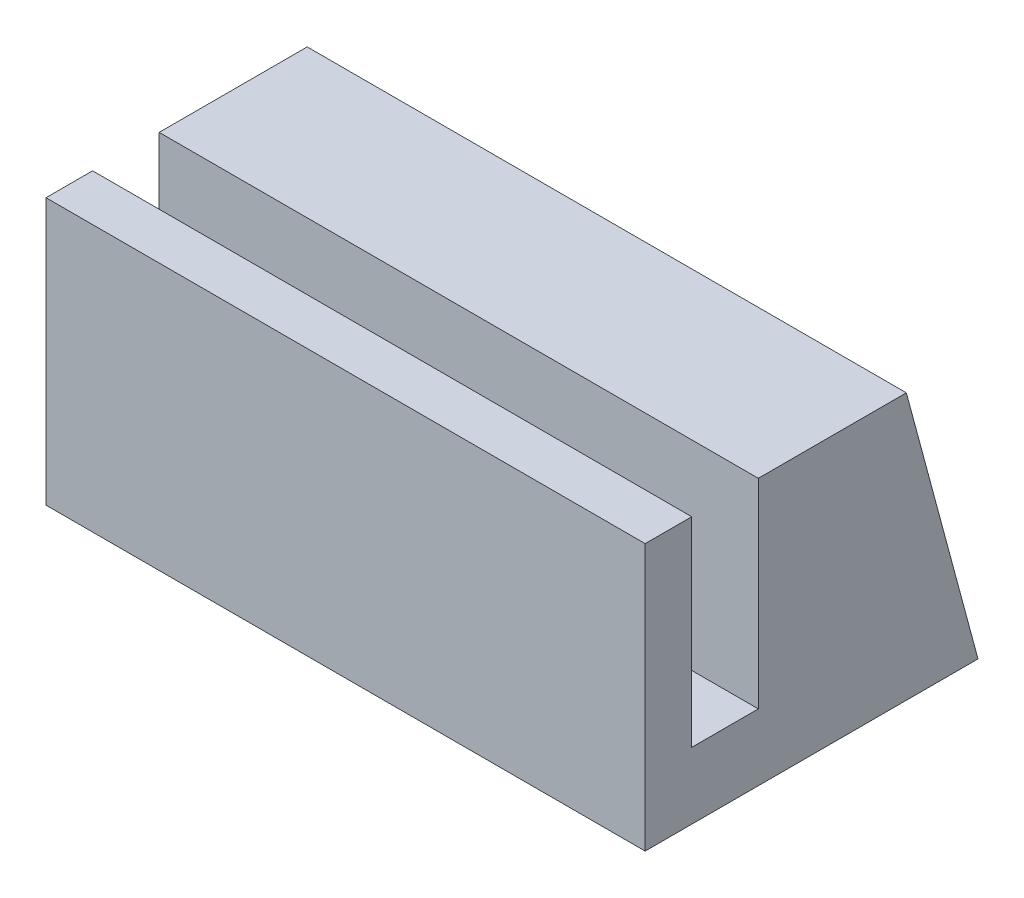
ISO-10303-21;
HEADER;
FILE_DESCRIPTION(('STEP AP214'),'2;1');
FILE_NAME('part.step','',(''),(''),'','','');
FILE_SCHEMA(('AUTOMOTIVE_DESIGN { 1 0 10303 214 1 1 1 1 }'));
ENDSEC;
DATA;
#1=APPLICATION_CONTEXT('core data for automotive mechanical design processes');
#2=APPLICATION_PROTOCOL_DEFINITION('international standard','automotive_design',2000,#1);
#3=PRODUCT_CONTEXT('',#1,'mechanical');
#4=PRODUCT('Part','Part','',(#3));
#5=PRODUCT_RELATED_PRODUCT_CATEGORY('part','',(#4));
#6=PRODUCT_DEFINITION_FORMATION('','',#4);
#7=PRODUCT_DEFINITION_CONTEXT('part definition',#1,'design');
#8=PRODUCT_DEFINITION('design','',#6,#7);
#9=PRODUCT_DEFINITION_SHAPE('','',#8);
#10=(LENGTH_UNIT() NAMED_UNIT(*) SI_UNIT(.MILLI.,.METRE.));
#11=(NAMED_UNIT(*) PLANE_ANGLE_UNIT() SI_UNIT($,.RADIAN.));
#12=(NAMED_UNIT(*) SI_UNIT($,.STERADIAN.) SOLID_ANGLE_UNIT());
#13=UNCERTAINTY_MEASURE_WITH_UNIT(LENGTH_MEASURE(1.E-05),#10,'distance_accuracy_value','');
#14=(GEOMETRIC_REPRESENTATION_CONTEXT(3) GLOBAL_UNCERTAINTY_ASSIGNED_CONTEXT((#13)) GLOBAL_UNIT_ASSIGNED_CONTEXT((#10,
#11,#12)) REPRESENTATION_CONTEXT('',''));
#15=CARTESIAN_POINT('',(0.,0.,0.));
#16=DIRECTION('',(0.,0.,1.));
#17=DIRECTION('',(1.,0.,0.));
#18=AXIS2_PLACEMENT_3D('',#15,#16,#17);
#19=CARTESIAN_POINT('',(22.5,-10.,25.));
#20=DIRECTION('',(-1.,0.,0.));
#21=DIRECTION('',(0.,0.,1.));
#22=AXIS2_PLACEMENT_3D('',#19,#20,#21);
#23=PLANE('',#22);
#24=DIRECTION('',(0.,0.,-1.));
#25=VECTOR('',#24,1.);
#26=CARTESIAN_POINT('',(22.5,-10.,25.));
#27=LINE('',#26,#25);
#28=CARTESIAN_POINT('',(22.5,-10.,25.));
#29=VERTEX_POINT('',#28);
#30=CARTESIAN_POINT('',(22.5,-10.,0.));
#31=VERTEX_POINT('',#30);
#32=EDGE_CURVE('E235',#29,#31,#27,.T.);
#33=ORIENTED_EDGE('',*,*,#32,.T.);
#34=DIRECTION('',(0.,-0.965652581891496,-0.259836662321326));
#35=VECTOR('',#34,1.);
#36=CARTESIAN_POINT('',(22.5,10.,5.38157650471693));
#37=LINE('',#36,#35);
#38=CARTESIAN_POINT('',(22.5,10.,5.38157650471693));
#39=VERTEX_POINT('',#38);
#40=EDGE_CURVE('E174',#39,#31,#37,.T.);
#41=ORIENTED_EDGE('',*,*,#40,.F.);
#42=DIRECTION('',(0.,0.,-1.));
#43=VECTOR('',#42,1.);
#44=CARTESIAN_POINT('',(22.5,10.,25.));
#45=LINE('',#44,#43);
#46=CARTESIAN_POINT('',(22.5,10.,16.5));
#47=VERTEX_POINT('',#46);
#48=EDGE_CURVE('E47',#47,#39,#45,.T.);
#49=ORIENTED_EDGE('',*,*,#48,.F.);
#50=DIRECTION('',(0.,1.,0.));
#51=VECTOR('',#50,1.);
#52=CARTESIAN_POINT('',(22.5,-5.,16.5));
#53=LINE('',#52,#51);
#54=CARTESIAN_POINT('',(22.5,-5.,16.5));
#55=VERTEX_POINT('',#54);
#56=EDGE_CURVE('E213',#55,#47,#53,.T.);
#57=ORIENTED_EDGE('',*,*,#56,.F.);
#58=DIRECTION('',(0.,0.,-1.));
#59=VECTOR('',#58,1.);
#60=CARTESIAN_POINT('',(22.5,-5.,0.));
#61=LINE('',#60,#59);
#62=CARTESIAN_POINT('',(22.5,-5.,21.5));
#63=VERTEX_POINT('',#62);
#64=EDGE_CURVE('E197',#63,#55,#61,.T.);
#65=ORIENTED_EDGE('',*,*,#64,.F.);
#66=DIRECTION('',(0.,1.,0.));
#67=VECTOR('',#66,1.);
#68=CARTESIAN_POINT('',(22.5,-5.,21.5));
#69=LINE('',#68,#67);
#70=CARTESIAN_POINT('',(22.5,10.,21.5));
#71=VERTEX_POINT('',#70);
#72=EDGE_CURVE('E216',#63,#71,#69,.T.);
#73=ORIENTED_EDGE('',*,*,#72,.T.);
#74=CARTESIAN_POINT('',(22.5,10.,25.));
#75=VERTEX_POINT('',#74);
#76=EDGE_CURVE('E11',#75,#71,#45,.T.);
#77=ORIENTED_EDGE('',*,*,#76,.F.);
#78=DIRECTION('',(0.,1.,0.));
#79=VECTOR('',#78,1.);
#80=CARTESIAN_POINT('',(22.5,-10.,25.));
#81=LINE('',#80,#79);
#82=EDGE_CURVE('E222',#29,#75,#81,.T.);
#83=ORIENTED_EDGE('',*,*,#82,.F.);
#84=EDGE_LOOP('',(#33,#41,#49,#57,#65,#73,#77,#83));
#85=FACE_BOUND('',#84,.T.);
#86=ADVANCED_FACE('F39',(#85),#23,.F.);
#87=CARTESIAN_POINT('',(-22.5,10.,25.));
#88=DIRECTION('',(0.,-1.,0.));
#89=DIRECTION('',(0.,0.,-1.));
#90=AXIS2_PLACEMENT_3D('',#87,#88,#89);
#91=PLANE('',#90);
#92=ORIENTED_EDGE('',*,*,#48,.T.);
#93=DIRECTION('',(1.,0.,0.));
#94=VECTOR('',#93,1.);
#95=CARTESIAN_POINT('',(-43.2113825148424,10.,5.38157650471693));
#96=LINE('',#95,#94);
#97=CARTESIAN_POINT('',(-22.5,10.,5.38157650471693));
#98=VERTEX_POINT('',#97);
#99=EDGE_CURVE('E184',#98,#39,#96,.T.);
#100=ORIENTED_EDGE('',*,*,#99,.F.);
#101=DIRECTION('',(0.,0.,-1.));
#102=VECTOR('',#101,1.);
#103=CARTESIAN_POINT('',(-22.5,10.,25.));
#104=LINE('',#103,#102);
#105=CARTESIAN_POINT('',(-22.5,10.,16.5));
#106=VERTEX_POINT('',#105);
#107=EDGE_CURVE('E245',#106,#98,#104,.T.);
#108=ORIENTED_EDGE('',*,*,#107,.F.);
#109=DIRECTION('',(1.,0.,0.));
#110=VECTOR('',#109,1.);
#111=CARTESIAN_POINT('',(0.,10.,16.5));
#112=LINE('',#111,#110);
#113=EDGE_CURVE('E193',#106,#47,#112,.T.);
#114=ORIENTED_EDGE('',*,*,#113,.T.);
#115=EDGE_LOOP('',(#92,#100,#108,#114));
#116=FACE_BOUND('',#115,.T.);
#117=ADVANCED_FACE('F264',(#116),#91,.F.);
#118=CARTESIAN_POINT('',(-22.5,-10.,25.));
#119=DIRECTION('',(1.,0.,0.));
#120=DIRECTION('',(0.,0.,-1.));
#121=AXIS2_PLACEMENT_3D('',#118,#119,#120);
#122=PLANE('',#121);
#123=ORIENTED_EDGE('',*,*,#107,.T.);
#124=DIRECTION('',(0.,0.965652581891496,0.259836662321326));
#125=VECTOR('',#124,1.);
#126=CARTESIAN_POINT('',(-22.5,10.,5.38157650471693));
#127=LINE('',#126,#125);
#128=CARTESIAN_POINT('',(-22.5,-10.,0.));
#129=VERTEX_POINT('',#128);
#130=EDGE_CURVE('E180',#129,#98,#127,.T.);
#131=ORIENTED_EDGE('',*,*,#130,.F.);
#132=DIRECTION('',(0.,0.,-1.));
#133=VECTOR('',#132,1.);
#134=CARTESIAN_POINT('',(-22.5,-10.,25.));
#135=LINE('',#134,#133);
#136=CARTESIAN_POINT('',(-22.5,-10.,25.));
#137=VERTEX_POINT('',#136);
#138=EDGE_CURVE('E242',#137,#129,#135,.T.);
#139=ORIENTED_EDGE('',*,*,#138,.F.);
#140=DIRECTION('',(0.,-1.,0.));
#141=VECTOR('',#140,1.);
#142=CARTESIAN_POINT('',(-22.5,-10.,25.));
#143=LINE('',#142,#141);
#144=CARTESIAN_POINT('',(-22.5,10.,25.));
#145=VERTEX_POINT('',#144);
#146=EDGE_CURVE('E229',#145,#137,#143,.T.);
#147=ORIENTED_EDGE('',*,*,#146,.F.);
#148=CARTESIAN_POINT('',(-22.5,10.,21.5));
#149=VERTEX_POINT('',#148);
#150=EDGE_CURVE('E246',#145,#149,#104,.T.);
#151=ORIENTED_EDGE('',*,*,#150,.T.);
#152=DIRECTION('',(0.,1.,0.));
#153=VECTOR('',#152,1.);
#154=CARTESIAN_POINT('',(-22.5,-5.,21.5));
#155=LINE('',#154,#153);
#156=CARTESIAN_POINT('',(-22.5,-5.,21.5));
#157=VERTEX_POINT('',#156);
#158=EDGE_CURVE('E202',#157,#149,#155,.T.);
#159=ORIENTED_EDGE('',*,*,#158,.F.);
#160=DIRECTION('',(0.,0.,1.));
#161=VECTOR('',#160,1.);
#162=CARTESIAN_POINT('',(-22.5,-5.,0.));
#163=LINE('',#162,#161);
#164=CARTESIAN_POINT('',(-22.5,-5.,16.5));
#165=VERTEX_POINT('',#164);
#166=EDGE_CURVE('E189',#165,#157,#163,.T.);
#167=ORIENTED_EDGE('',*,*,#166,.F.);
#168=DIRECTION('',(0.,1.,0.));
#169=VECTOR('',#168,1.);
#170=CARTESIAN_POINT('',(-22.5,-5.,16.5));
#171=LINE('',#170,#169);
#172=EDGE_CURVE('E208',#165,#106,#171,.T.);
#173=ORIENTED_EDGE('',*,*,#172,.T.);
#174=EDGE_LOOP('',(#123,#131,#139,#147,#151,#159,#167,#173));
#175=FACE_BOUND('',#174,.T.);
#176=ADVANCED_FACE('F259',(#175),#122,.F.);
#177=ORIENTED_EDGE('',*,*,#76,.T.);
#178=DIRECTION('',(1.,0.,0.));
#179=VECTOR('',#178,1.);
#180=CARTESIAN_POINT('',(0.,10.,21.5));
#181=LINE('',#180,#179);
#182=EDGE_CURVE('E183',#149,#71,#181,.T.);
#183=ORIENTED_EDGE('',*,*,#182,.F.);
#184=ORIENTED_EDGE('',*,*,#150,.F.);
#185=DIRECTION('',(-1.,0.,0.));
#186=VECTOR('',#185,1.);
#187=CARTESIAN_POINT('',(-22.5,10.,25.));
#188=LINE('',#187,#186);
#189=EDGE_CURVE('E226',#75,#145,#188,.T.);
#190=ORIENTED_EDGE('',*,*,#189,.F.);
#191=EDGE_LOOP('',(#177,#183,#184,#190));
#192=FACE_BOUND('',#191,.T.);
#193=ADVANCED_FACE('F281',(#192),#91,.F.);
#194=CARTESIAN_POINT('',(-22.5,-10.,25.));
#195=DIRECTION('',(0.,1.,0.));
#196=DIRECTION('',(0.,0.,1.));
#197=AXIS2_PLACEMENT_3D('',#194,#195,#196);
#198=PLANE('',#197);
#199=DIRECTION('',(1.,0.,0.));
#200=VECTOR('',#199,1.);
#201=CARTESIAN_POINT('',(-22.5,-10.,0.));
#202=LINE('',#201,#200);
#203=EDGE_CURVE('E212',#129,#31,#202,.T.);
#204=ORIENTED_EDGE('',*,*,#203,.T.);
#205=ORIENTED_EDGE('',*,*,#32,.F.);
#206=DIRECTION('',(1.,0.,0.));
#207=VECTOR('',#206,1.);
#208=CARTESIAN_POINT('',(-22.5,-10.,25.));
#209=LINE('',#208,#207);
#210=EDGE_CURVE('E232',#137,#29,#209,.T.);
#211=ORIENTED_EDGE('',*,*,#210,.F.);
#212=ORIENTED_EDGE('',*,*,#138,.T.);
#213=EDGE_LOOP('',(#204,#205,#211,#212));
#214=FACE_BOUND('',#213,.T.);
#215=ADVANCED_FACE('F276',(#214),#198,.F.);
#216=CARTESIAN_POINT('',(0.,0.,25.));
#217=DIRECTION('',(0.,0.,-1.));
#218=DIRECTION('',(-1.,0.,0.));
#219=AXIS2_PLACEMENT_3D('',#216,#217,#218);
#220=PLANE('',#219);
#221=ORIENTED_EDGE('',*,*,#82,.T.);
#222=ORIENTED_EDGE('',*,*,#189,.T.);
#223=ORIENTED_EDGE('',*,*,#146,.T.);
#224=ORIENTED_EDGE('',*,*,#210,.T.);
#225=EDGE_LOOP('',(#221,#222,#223,#224));
#226=FACE_BOUND('',#225,.T.);
#227=ADVANCED_FACE('F278',(#226),#220,.F.);
#228=CARTESIAN_POINT('',(0.,-5.,16.5));
#229=DIRECTION('',(0.,0.,1.));
#230=DIRECTION('',(1.,0.,0.));
#231=AXIS2_PLACEMENT_3D('',#228,#229,#230);
#232=PLANE('',#231);
#233=ORIENTED_EDGE('',*,*,#113,.F.);
#234=ORIENTED_EDGE('',*,*,#172,.F.);
#235=DIRECTION('',(1.,0.,0.));
#236=VECTOR('',#235,1.);
#237=CARTESIAN_POINT('',(0.,-5.,16.5));
#238=LINE('',#237,#236);
#239=EDGE_CURVE('E62',#165,#55,#238,.T.);
#240=ORIENTED_EDGE('',*,*,#239,.T.);
#241=ORIENTED_EDGE('',*,*,#56,.T.);
#242=EDGE_LOOP('',(#233,#234,#240,#241));
#243=FACE_BOUND('',#242,.T.);
#244=ADVANCED_FACE('F294',(#243),#232,.T.);
#245=CARTESIAN_POINT('',(0.,-5.,21.5));
#246=DIRECTION('',(0.,0.,1.));
#247=DIRECTION('',(1.,0.,0.));
#248=AXIS2_PLACEMENT_3D('',#245,#246,#247);
#249=PLANE('',#248);
#250=ORIENTED_EDGE('',*,*,#182,.T.);
#251=ORIENTED_EDGE('',*,*,#72,.F.);
#252=DIRECTION('',(1.,0.,0.));
#253=VECTOR('',#252,1.);
#254=CARTESIAN_POINT('',(0.,-5.,21.5));
#255=LINE('',#254,#253);
#256=EDGE_CURVE('E192',#157,#63,#255,.T.);
#257=ORIENTED_EDGE('',*,*,#256,.F.);
#258=ORIENTED_EDGE('',*,*,#158,.T.);
#259=EDGE_LOOP('',(#250,#251,#257,#258));
#260=FACE_BOUND('',#259,.T.);
#261=ADVANCED_FACE('F283',(#260),#249,.F.);
#262=CARTESIAN_POINT('',(0.,-5.,0.));
#263=DIRECTION('',(0.,1.,0.));
#264=DIRECTION('',(0.,0.,1.));
#265=AXIS2_PLACEMENT_3D('',#262,#263,#264);
#266=PLANE('',#265);
#267=ORIENTED_EDGE('',*,*,#166,.T.);
#268=ORIENTED_EDGE('',*,*,#256,.T.);
#269=ORIENTED_EDGE('',*,*,#64,.T.);
#270=ORIENTED_EDGE('',*,*,#239,.F.);
#271=EDGE_LOOP('',(#267,#268,#269,#270));
#272=FACE_BOUND('',#271,.T.);
#273=ADVANCED_FACE('F285',(#272),#266,.T.);
#274=CARTESIAN_POINT('',(-43.2113825148424,10.,5.38157650471693));
#275=DIRECTION('',(0.,-0.259836662321326,0.965652581891496));
#276=DIRECTION('',(0.,-0.965652581891496,-0.259836662321326));
#277=AXIS2_PLACEMENT_3D('',#274,#275,#276);
#278=PLANE('',#277);
#279=DIRECTION('',(1.,0.,0.));
#280=VECTOR('',#279,1.);
#281=CARTESIAN_POINT('',(19.15,3.95998148221632,3.75633541754894));
#282=LINE('',#281,#280);
#283=CARTESIAN_POINT('',(-19.15,3.95998148221631,3.75633541754893));
#284=VERTEX_POINT('',#283);
#285=CARTESIAN_POINT('',(19.15,3.95998148221632,3.75633541754894));
#286=VERTEX_POINT('',#285);
#287=EDGE_CURVE('E165',#284,#286,#282,.T.);
#288=ORIENTED_EDGE('',*,*,#287,.F.);
#289=DIRECTION('',(0.,0.965652581891496,0.259836662321326));
#290=VECTOR('',#289,1.);
#291=CARTESIAN_POINT('',(-19.15,-5.31028330394205,1.26190345926421));
#292=LINE('',#291,#290);
#293=CARTESIAN_POINT('',(-19.15,-5.31028330394205,1.26190345926421));
#294=VERTEX_POINT('',#293);
#295=EDGE_CURVE('E54',#294,#284,#292,.T.);
#296=ORIENTED_EDGE('',*,*,#295,.F.);
#297=DIRECTION('',(-1.,0.,0.));
#298=VECTOR('',#297,1.);
#299=CARTESIAN_POINT('',(19.15,-5.31028330394205,1.26190345926421));
#300=LINE('',#299,#298);
#301=CARTESIAN_POINT('',(19.15,-5.31028330394205,1.26190345926421));
#302=VERTEX_POINT('',#301);
#303=EDGE_CURVE('E152',#302,#294,#300,.T.);
#304=ORIENTED_EDGE('',*,*,#303,.F.);
#305=DIRECTION('',(0.,-0.965652581891496,-0.259836662321326));
#306=VECTOR('',#305,1.);
#307=CARTESIAN_POINT('',(19.15,-5.31028330394205,1.26190345926421));
#308=LINE('',#307,#306);
#309=EDGE_CURVE('E156',#286,#302,#308,.T.);
#310=ORIENTED_EDGE('',*,*,#309,.F.);
#311=EDGE_LOOP('',(#288,#296,#304,#310));
#312=FACE_BOUND('',#311,.T.);
#313=ORIENTED_EDGE('',*,*,#130,.T.);
#314=ORIENTED_EDGE('',*,*,#99,.T.);
#315=ORIENTED_EDGE('',*,*,#40,.T.);
#316=ORIENTED_EDGE('',*,*,#203,.F.);
#317=EDGE_LOOP('',(#313,#314,#315,#316));
#318=FACE_BOUND('',#317,.T.);
#319=ADVANCED_FACE('F268',(#312,#318),#278,.F.);
#320=CARTESIAN_POINT('',(-19.15,-7.90864992715531,10.9184292781792));
#321=DIRECTION('',(-1.,0.,0.));
#322=DIRECTION('',(0.,0.,1.));
#323=AXIS2_PLACEMENT_3D('',#320,#321,#322);
#324=PLANE('',#323);
#325=ORIENTED_EDGE('',*,*,#295,.T.);
#326=DIRECTION('',(0.,0.259836662321326,-0.965652581891496));
#327=VECTOR('',#326,1.);
#328=CARTESIAN_POINT('',(-19.15,1.36161485900306,13.4128612364639));
#329=LINE('',#328,#327);
#330=CARTESIAN_POINT('',(-19.15,1.36161485900306,13.4128612364639));
#331=VERTEX_POINT('',#330);
#332=EDGE_CURVE('E127',#331,#284,#329,.T.);
#333=ORIENTED_EDGE('',*,*,#332,.F.);
#334=DIRECTION('',(0.,0.965652581891496,0.259836662321326));
#335=VECTOR('',#334,1.);
#336=CARTESIAN_POINT('',(-19.15,-7.90864992715531,10.9184292781792));
#337=LINE('',#336,#335);
#338=CARTESIAN_POINT('',(-19.15,-7.90864992715531,10.9184292781792));
#339=VERTEX_POINT('',#338);
#340=EDGE_CURVE('E131',#339,#331,#337,.T.);
#341=ORIENTED_EDGE('',*,*,#340,.F.);
#342=DIRECTION('',(0.,0.259836662321326,-0.965652581891496));
#343=VECTOR('',#342,1.);
#344=CARTESIAN_POINT('',(-19.15,-7.90864992715531,10.9184292781792));
#345=LINE('',#344,#343);
#346=EDGE_CURVE('E171',#339,#294,#345,.T.);
#347=ORIENTED_EDGE('',*,*,#346,.T.);
#348=EDGE_LOOP('',(#325,#333,#341,#347));
#349=FACE_BOUND('',#348,.T.);
#350=ADVANCED_FACE('F129',(#349),#324,.F.);
#351=CARTESIAN_POINT('',(19.15,-7.90864992715531,10.9184292781792));
#352=DIRECTION('',(0.,-0.965652581891496,-0.259836662321326));
#353=DIRECTION('',(0.,0.259836662321326,-0.965652581891496));
#354=AXIS2_PLACEMENT_3D('',#351,#352,#353);
#355=PLANE('',#354);
#356=ORIENTED_EDGE('',*,*,#303,.T.);
#357=ORIENTED_EDGE('',*,*,#346,.F.);
#358=DIRECTION('',(-1.,0.,0.));
#359=VECTOR('',#358,1.);
#360=CARTESIAN_POINT('',(19.15,-7.90864992715531,10.9184292781792));
#361=LINE('',#360,#359);
#362=CARTESIAN_POINT('',(19.15,-7.90864992715531,10.9184292781792));
#363=VERTEX_POINT('',#362);
#364=EDGE_CURVE('E138',#363,#339,#361,.T.);
#365=ORIENTED_EDGE('',*,*,#364,.F.);
#366=DIRECTION('',(0.,0.259836662321326,-0.965652581891496));
#367=VECTOR('',#366,1.);
#368=CARTESIAN_POINT('',(19.15,-7.90864992715531,10.9184292781792));
#369=LINE('',#368,#367);
#370=EDGE_CURVE('E175',#363,#302,#369,.T.);
#371=ORIENTED_EDGE('',*,*,#370,.T.);
#372=EDGE_LOOP('',(#356,#357,#365,#371));
#373=FACE_BOUND('',#372,.T.);
#374=ADVANCED_FACE('F363',(#373),#355,.F.);
#375=CARTESIAN_POINT('',(19.15,-7.90864992715531,10.9184292781792));
#376=DIRECTION('',(1.,0.,0.));
#377=DIRECTION('',(0.,0.,-1.));
#378=AXIS2_PLACEMENT_3D('',#375,#376,#377);
#379=PLANE('',#378);
#380=ORIENTED_EDGE('',*,*,#309,.T.);
#381=ORIENTED_EDGE('',*,*,#370,.F.);
#382=DIRECTION('',(0.,-0.965652581891496,-0.259836662321326));
#383=VECTOR('',#382,1.);
#384=CARTESIAN_POINT('',(19.15,-7.90864992715531,10.9184292781792));
#385=LINE('',#384,#383);
#386=CARTESIAN_POINT('',(19.15,1.36161485900306,13.4128612364639));
#387=VERTEX_POINT('',#386);
#388=EDGE_CURVE('E147',#387,#363,#385,.T.);
#389=ORIENTED_EDGE('',*,*,#388,.F.);
#390=DIRECTION('',(0.,0.259836662321326,-0.965652581891496));
#391=VECTOR('',#390,1.);
#392=CARTESIAN_POINT('',(19.15,1.36161485900306,13.4128612364639));
#393=LINE('',#392,#391);
#394=EDGE_CURVE('E137',#387,#286,#393,.T.);
#395=ORIENTED_EDGE('',*,*,#394,.T.);
#396=EDGE_LOOP('',(#380,#381,#389,#395));
#397=FACE_BOUND('',#396,.T.);
#398=ADVANCED_FACE('F372',(#397),#379,.F.);
#399=CARTESIAN_POINT('',(19.15,1.36161485900306,13.4128612364639));
#400=DIRECTION('',(0.,0.965652581891496,0.259836662321326));
#401=DIRECTION('',(0.,-0.259836662321326,0.965652581891496));
#402=AXIS2_PLACEMENT_3D('',#399,#400,#401);
#403=PLANE('',#402);
#404=ORIENTED_EDGE('',*,*,#287,.T.);
#405=ORIENTED_EDGE('',*,*,#394,.F.);
#406=DIRECTION('',(1.,0.,0.));
#407=VECTOR('',#406,1.);
#408=CARTESIAN_POINT('',(19.15,1.36161485900306,13.4128612364639));
#409=LINE('',#408,#407);
#410=EDGE_CURVE('E141',#331,#387,#409,.T.);
#411=ORIENTED_EDGE('',*,*,#410,.F.);
#412=ORIENTED_EDGE('',*,*,#332,.T.);
#413=EDGE_LOOP('',(#404,#405,#411,#412));
#414=FACE_BOUND('',#413,.T.);
#415=ADVANCED_FACE('F142',(#414),#403,.F.);
#416=CARTESIAN_POINT('',(0.,-3.27351753407613,12.1656452573215));
#417=DIRECTION('',(0.,-0.259836662321326,0.965652581891496));
#418=DIRECTION('',(0.,-0.965652581891496,-0.259836662321326));
#419=AXIS2_PLACEMENT_3D('',#416,#417,#418);
#420=PLANE('',#419);
#421=ORIENTED_EDGE('',*,*,#340,.T.);
#422=ORIENTED_EDGE('',*,*,#410,.T.);
#423=ORIENTED_EDGE('',*,*,#388,.T.);
#424=ORIENTED_EDGE('',*,*,#364,.T.);
#425=EDGE_LOOP('',(#421,#422,#423,#424));
#426=FACE_BOUND('',#425,.T.);
#427=ADVANCED_FACE('F149',(#426),#420,.F.);
#428=CLOSED_SHELL('',(#86,#117,#176,#193,#215,#227,#244,#261,#273,#319,#350,#374,#398,#415,#427));
#429=MANIFOLD_SOLID_BREP('B2',#428);
#430=ADVANCED_BREP_SHAPE_REPRESENTATION('',(#18,#429),#14);
#431=SHAPE_DEFINITION_REPRESENTATION(#9,#430);
ENDSEC;
END-ISO-10303-21;
